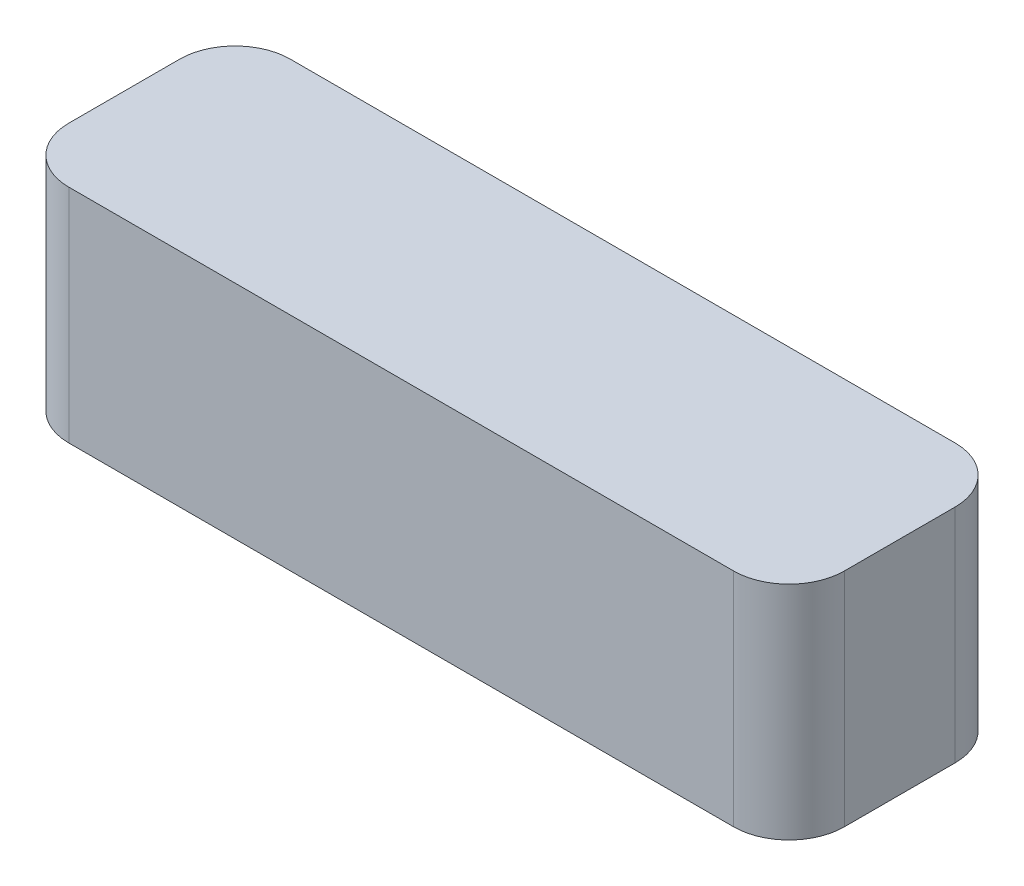
ISO-10303-21;
HEADER;
FILE_DESCRIPTION(('STEP AP214'),'2;1');
FILE_NAME('part.step','',(''),(''),'','','');
FILE_SCHEMA(('AUTOMOTIVE_DESIGN { 1 0 10303 214 1 1 1 1 }'));
ENDSEC;
DATA;
#1=APPLICATION_CONTEXT('core data for automotive mechanical design processes');
#2=APPLICATION_PROTOCOL_DEFINITION('international standard','automotive_design',2000,#1);
#3=PRODUCT_CONTEXT('',#1,'mechanical');
#4=PRODUCT('Part','Part','',(#3));
#5=PRODUCT_RELATED_PRODUCT_CATEGORY('part','',(#4));
#6=PRODUCT_DEFINITION_FORMATION('','',#4);
#7=PRODUCT_DEFINITION_CONTEXT('part definition',#1,'design');
#8=PRODUCT_DEFINITION('design','',#6,#7);
#9=PRODUCT_DEFINITION_SHAPE('','',#8);
#10=(LENGTH_UNIT() NAMED_UNIT(*) SI_UNIT(.MILLI.,.METRE.));
#11=(NAMED_UNIT(*) PLANE_ANGLE_UNIT() SI_UNIT($,.RADIAN.));
#12=(NAMED_UNIT(*) SI_UNIT($,.STERADIAN.) SOLID_ANGLE_UNIT());
#13=UNCERTAINTY_MEASURE_WITH_UNIT(LENGTH_MEASURE(1.E-05),#10,'distance_accuracy_value','');
#14=(GEOMETRIC_REPRESENTATION_CONTEXT(3) GLOBAL_UNCERTAINTY_ASSIGNED_CONTEXT((#13)) GLOBAL_UNIT_ASSIGNED_CONTEXT((#10,
#11,#12)) REPRESENTATION_CONTEXT('',''));
#15=CARTESIAN_POINT('',(0.,0.,0.));
#16=DIRECTION('',(0.,0.,1.));
#17=DIRECTION('',(1.,0.,0.));
#18=AXIS2_PLACEMENT_3D('',#15,#16,#17);
#19=CARTESIAN_POINT('',(6.,4.,-1.));
#20=DIRECTION('',(0.,-1.,0.));
#21=DIRECTION('',(0.,0.,-1.));
#22=AXIS2_PLACEMENT_3D('',#19,#20,#21);
#23=CYLINDRICAL_SURFACE('',#22,1.);
#24=CARTESIAN_POINT('',(6.,0.,-1.));
#25=DIRECTION('',(0.,1.,0.));
#26=DIRECTION('',(0.,0.,-1.));
#27=AXIS2_PLACEMENT_3D('',#24,#25,#26);
#28=CIRCLE('',#27,1.);
#29=CARTESIAN_POINT('',(7.,0.,-0.999999999999994));
#30=VERTEX_POINT('',#29);
#31=CARTESIAN_POINT('',(5.99999999999999,0.,-2.));
#32=VERTEX_POINT('',#31);
#33=EDGE_CURVE('E131',#30,#32,#28,.T.);
#34=ORIENTED_EDGE('',*,*,#33,.T.);
#35=DIRECTION('',(0.,-1.,0.));
#36=VECTOR('',#35,1.);
#37=CARTESIAN_POINT('',(5.99999999999999,4.,-2.));
#38=LINE('',#37,#36);
#39=CARTESIAN_POINT('',(5.99999999999999,4.,-2.));
#40=VERTEX_POINT('',#39);
#41=EDGE_CURVE('E11',#40,#32,#38,.T.);
#42=ORIENTED_EDGE('',*,*,#41,.F.);
#43=CARTESIAN_POINT('',(6.,4.,-1.));
#44=DIRECTION('',(0.,1.,0.));
#45=DIRECTION('',(0.,0.,-1.));
#46=AXIS2_PLACEMENT_3D('',#43,#44,#45);
#47=CIRCLE('',#46,1.);
#48=CARTESIAN_POINT('',(7.,4.,-0.999999999999994));
#49=VERTEX_POINT('',#48);
#50=EDGE_CURVE('E145',#49,#40,#47,.T.);
#51=ORIENTED_EDGE('',*,*,#50,.F.);
#52=DIRECTION('',(0.,-1.,0.));
#53=VECTOR('',#52,1.);
#54=CARTESIAN_POINT('',(7.,4.,-0.999999999999994));
#55=LINE('',#54,#53);
#56=EDGE_CURVE('E127',#49,#30,#55,.T.);
#57=ORIENTED_EDGE('',*,*,#56,.T.);
#58=EDGE_LOOP('',(#34,#42,#51,#57));
#59=FACE_BOUND('',#58,.T.);
#60=ADVANCED_FACE('F35',(#59),#23,.T.);
#61=CARTESIAN_POINT('',(-5.99999999999999,4.,-2.));
#62=DIRECTION('',(0.,0.,1.));
#63=DIRECTION('',(1.,0.,0.));
#64=AXIS2_PLACEMENT_3D('',#61,#62,#63);
#65=PLANE('',#64);
#66=DIRECTION('',(-1.,0.,0.));
#67=VECTOR('',#66,1.);
#68=CARTESIAN_POINT('',(-5.99999999999999,0.,-2.));
#69=LINE('',#68,#67);
#70=CARTESIAN_POINT('',(-5.99999999999999,0.,-2.));
#71=VERTEX_POINT('',#70);
#72=EDGE_CURVE('E134',#32,#71,#69,.T.);
#73=ORIENTED_EDGE('',*,*,#72,.T.);
#74=DIRECTION('',(0.,-1.,0.));
#75=VECTOR('',#74,1.);
#76=CARTESIAN_POINT('',(-5.99999999999999,4.,-2.));
#77=LINE('',#76,#75);
#78=CARTESIAN_POINT('',(-5.99999999999999,4.,-2.));
#79=VERTEX_POINT('',#78);
#80=EDGE_CURVE('E43',#79,#71,#77,.T.);
#81=ORIENTED_EDGE('',*,*,#80,.F.);
#82=DIRECTION('',(-1.,0.,0.));
#83=VECTOR('',#82,1.);
#84=CARTESIAN_POINT('',(-5.99999999999999,4.,-2.));
#85=LINE('',#84,#83);
#86=EDGE_CURVE('E94',#40,#79,#85,.T.);
#87=ORIENTED_EDGE('',*,*,#86,.F.);
#88=ORIENTED_EDGE('',*,*,#41,.T.);
#89=EDGE_LOOP('',(#73,#81,#87,#88));
#90=FACE_BOUND('',#89,.T.);
#91=ADVANCED_FACE('F180',(#90),#65,.F.);
#92=CARTESIAN_POINT('',(-6.,4.,-1.));
#93=DIRECTION('',(0.,-1.,0.));
#94=DIRECTION('',(0.,0.,-1.));
#95=AXIS2_PLACEMENT_3D('',#92,#93,#94);
#96=CYLINDRICAL_SURFACE('',#95,1.);
#97=CARTESIAN_POINT('',(-6.,0.,-1.));
#98=DIRECTION('',(0.,1.,0.));
#99=DIRECTION('',(0.,0.,1.));
#100=AXIS2_PLACEMENT_3D('',#97,#98,#99);
#101=CIRCLE('',#100,1.);
#102=CARTESIAN_POINT('',(-7.,0.,-0.999999999999994));
#103=VERTEX_POINT('',#102);
#104=EDGE_CURVE('E136',#71,#103,#101,.T.);
#105=ORIENTED_EDGE('',*,*,#104,.T.);
#106=DIRECTION('',(0.,-1.,0.));
#107=VECTOR('',#106,1.);
#108=CARTESIAN_POINT('',(-7.,4.,-0.999999999999994));
#109=LINE('',#108,#107);
#110=CARTESIAN_POINT('',(-7.,4.,-0.999999999999994));
#111=VERTEX_POINT('',#110);
#112=EDGE_CURVE('E152',#111,#103,#109,.T.);
#113=ORIENTED_EDGE('',*,*,#112,.F.);
#114=CARTESIAN_POINT('',(-6.,4.,-1.));
#115=DIRECTION('',(0.,1.,0.));
#116=DIRECTION('',(0.,0.,1.));
#117=AXIS2_PLACEMENT_3D('',#114,#115,#116);
#118=CIRCLE('',#117,1.);
#119=EDGE_CURVE('E160',#79,#111,#118,.T.);
#120=ORIENTED_EDGE('',*,*,#119,.F.);
#121=ORIENTED_EDGE('',*,*,#80,.T.);
#122=EDGE_LOOP('',(#105,#113,#120,#121));
#123=FACE_BOUND('',#122,.T.);
#124=ADVANCED_FACE('F158',(#123),#96,.T.);
#125=CARTESIAN_POINT('',(-7.,4.,-0.999999999999993));
#126=DIRECTION('',(1.,0.,0.));
#127=DIRECTION('',(0.,0.,-1.));
#128=AXIS2_PLACEMENT_3D('',#125,#126,#127);
#129=PLANE('',#128);
#130=DIRECTION('',(0.,0.,1.));
#131=VECTOR('',#130,1.);
#132=CARTESIAN_POINT('',(-7.,0.,-0.999999999999993));
#133=LINE('',#132,#131);
#134=CARTESIAN_POINT('',(-7.,0.,0.999999999999992));
#135=VERTEX_POINT('',#134);
#136=EDGE_CURVE('E138',#103,#135,#133,.T.);
#137=ORIENTED_EDGE('',*,*,#136,.T.);
#138=DIRECTION('',(0.,-1.,0.));
#139=VECTOR('',#138,1.);
#140=CARTESIAN_POINT('',(-7.,4.,0.999999999999992));
#141=LINE('',#140,#139);
#142=CARTESIAN_POINT('',(-7.,4.,0.999999999999992));
#143=VERTEX_POINT('',#142);
#144=EDGE_CURVE('E149',#143,#135,#141,.T.);
#145=ORIENTED_EDGE('',*,*,#144,.F.);
#146=DIRECTION('',(0.,0.,1.));
#147=VECTOR('',#146,1.);
#148=CARTESIAN_POINT('',(-7.,4.,-0.999999999999993));
#149=LINE('',#148,#147);
#150=EDGE_CURVE('E172',#111,#143,#149,.T.);
#151=ORIENTED_EDGE('',*,*,#150,.F.);
#152=ORIENTED_EDGE('',*,*,#112,.T.);
#153=EDGE_LOOP('',(#137,#145,#151,#152));
#154=FACE_BOUND('',#153,.T.);
#155=ADVANCED_FACE('F168',(#154),#129,.F.);
#156=CARTESIAN_POINT('',(-6.,4.,1.));
#157=DIRECTION('',(0.,-1.,0.));
#158=DIRECTION('',(0.,0.,-1.));
#159=AXIS2_PLACEMENT_3D('',#156,#157,#158);
#160=CYLINDRICAL_SURFACE('',#159,1.);
#161=CARTESIAN_POINT('',(-6.,0.,1.));
#162=DIRECTION('',(0.,1.,0.));
#163=DIRECTION('',(0.,0.,1.));
#164=AXIS2_PLACEMENT_3D('',#161,#162,#163);
#165=CIRCLE('',#164,1.);
#166=CARTESIAN_POINT('',(-6.,0.,2.));
#167=VERTEX_POINT('',#166);
#168=EDGE_CURVE('E140',#135,#167,#165,.T.);
#169=ORIENTED_EDGE('',*,*,#168,.T.);
#170=DIRECTION('',(0.,-1.,0.));
#171=VECTOR('',#170,1.);
#172=CARTESIAN_POINT('',(-6.,4.,2.));
#173=LINE('',#172,#171);
#174=CARTESIAN_POINT('',(-6.,4.,2.));
#175=VERTEX_POINT('',#174);
#176=EDGE_CURVE('E122',#175,#167,#173,.T.);
#177=ORIENTED_EDGE('',*,*,#176,.F.);
#178=CARTESIAN_POINT('',(-6.,4.,1.));
#179=DIRECTION('',(0.,1.,0.));
#180=DIRECTION('',(0.,0.,1.));
#181=AXIS2_PLACEMENT_3D('',#178,#179,#180);
#182=CIRCLE('',#181,1.);
#183=EDGE_CURVE('E113',#143,#175,#182,.T.);
#184=ORIENTED_EDGE('',*,*,#183,.F.);
#185=ORIENTED_EDGE('',*,*,#144,.T.);
#186=EDGE_LOOP('',(#169,#177,#184,#185));
#187=FACE_BOUND('',#186,.T.);
#188=ADVANCED_FACE('F171',(#187),#160,.T.);
#189=CARTESIAN_POINT('',(-5.99999999999999,4.,2.));
#190=DIRECTION('',(0.,0.,-1.));
#191=DIRECTION('',(-1.,0.,0.));
#192=AXIS2_PLACEMENT_3D('',#189,#190,#191);
#193=PLANE('',#192);
#194=DIRECTION('',(1.,0.,0.));
#195=VECTOR('',#194,1.);
#196=CARTESIAN_POINT('',(-5.99999999999999,0.,2.));
#197=LINE('',#196,#195);
#198=CARTESIAN_POINT('',(5.99999999999999,0.,2.));
#199=VERTEX_POINT('',#198);
#200=EDGE_CURVE('E121',#167,#199,#197,.T.);
#201=ORIENTED_EDGE('',*,*,#200,.T.);
#202=DIRECTION('',(0.,-1.,0.));
#203=VECTOR('',#202,1.);
#204=CARTESIAN_POINT('',(5.99999999999999,4.,2.));
#205=LINE('',#204,#203);
#206=CARTESIAN_POINT('',(5.99999999999999,4.,2.));
#207=VERTEX_POINT('',#206);
#208=EDGE_CURVE('E118',#207,#199,#205,.T.);
#209=ORIENTED_EDGE('',*,*,#208,.F.);
#210=DIRECTION('',(1.,0.,0.));
#211=VECTOR('',#210,1.);
#212=CARTESIAN_POINT('',(-5.99999999999999,4.,2.));
#213=LINE('',#212,#211);
#214=EDGE_CURVE('E107',#175,#207,#213,.T.);
#215=ORIENTED_EDGE('',*,*,#214,.F.);
#216=ORIENTED_EDGE('',*,*,#176,.T.);
#217=EDGE_LOOP('',(#201,#209,#215,#216));
#218=FACE_BOUND('',#217,.T.);
#219=ADVANCED_FACE('F119',(#218),#193,.F.);
#220=CARTESIAN_POINT('',(6.,4.,1.));
#221=DIRECTION('',(0.,-1.,0.));
#222=DIRECTION('',(0.,0.,-1.));
#223=AXIS2_PLACEMENT_3D('',#220,#221,#222);
#224=CYLINDRICAL_SURFACE('',#223,1.);
#225=CARTESIAN_POINT('',(6.,0.,1.));
#226=DIRECTION('',(0.,1.,0.));
#227=DIRECTION('',(0.,0.,1.));
#228=AXIS2_PLACEMENT_3D('',#225,#226,#227);
#229=CIRCLE('',#228,1.);
#230=CARTESIAN_POINT('',(7.,0.,0.999999999999993));
#231=VERTEX_POINT('',#230);
#232=EDGE_CURVE('E80',#199,#231,#229,.T.);
#233=ORIENTED_EDGE('',*,*,#232,.T.);
#234=DIRECTION('',(0.,-1.,0.));
#235=VECTOR('',#234,1.);
#236=CARTESIAN_POINT('',(7.,4.,0.999999999999993));
#237=LINE('',#236,#235);
#238=CARTESIAN_POINT('',(7.,4.,0.999999999999993));
#239=VERTEX_POINT('',#238);
#240=EDGE_CURVE('E123',#239,#231,#237,.T.);
#241=ORIENTED_EDGE('',*,*,#240,.F.);
#242=CARTESIAN_POINT('',(6.,4.,1.));
#243=DIRECTION('',(0.,1.,0.));
#244=DIRECTION('',(0.,0.,1.));
#245=AXIS2_PLACEMENT_3D('',#242,#243,#244);
#246=CIRCLE('',#245,1.);
#247=EDGE_CURVE('E111',#207,#239,#246,.T.);
#248=ORIENTED_EDGE('',*,*,#247,.F.);
#249=ORIENTED_EDGE('',*,*,#208,.T.);
#250=EDGE_LOOP('',(#233,#241,#248,#249));
#251=FACE_BOUND('',#250,.T.);
#252=ADVANCED_FACE('F125',(#251),#224,.T.);
#253=CARTESIAN_POINT('',(7.,4.,-0.999999999999994));
#254=DIRECTION('',(-1.,0.,0.));
#255=DIRECTION('',(0.,0.,1.));
#256=AXIS2_PLACEMENT_3D('',#253,#254,#255);
#257=PLANE('',#256);
#258=DIRECTION('',(0.,0.,-1.));
#259=VECTOR('',#258,1.);
#260=CARTESIAN_POINT('',(7.,0.,-0.999999999999994));
#261=LINE('',#260,#259);
#262=EDGE_CURVE('E86',#231,#30,#261,.T.);
#263=ORIENTED_EDGE('',*,*,#262,.T.);
#264=ORIENTED_EDGE('',*,*,#56,.F.);
#265=DIRECTION('',(0.,0.,-1.));
#266=VECTOR('',#265,1.);
#267=CARTESIAN_POINT('',(7.,4.,-0.999999999999994));
#268=LINE('',#267,#266);
#269=EDGE_CURVE('E51',#239,#49,#268,.T.);
#270=ORIENTED_EDGE('',*,*,#269,.F.);
#271=ORIENTED_EDGE('',*,*,#240,.T.);
#272=EDGE_LOOP('',(#263,#264,#270,#271));
#273=FACE_BOUND('',#272,.T.);
#274=ADVANCED_FACE('F196',(#273),#257,.F.);
#275=CARTESIAN_POINT('',(6.,4.,-1.));
#276=DIRECTION('',(0.,-1.,0.));
#277=DIRECTION('',(0.,0.,-1.));
#278=AXIS2_PLACEMENT_3D('',#275,#276,#277);
#279=PLANE('',#278);
#280=ORIENTED_EDGE('',*,*,#50,.T.);
#281=ORIENTED_EDGE('',*,*,#86,.T.);
#282=ORIENTED_EDGE('',*,*,#119,.T.);
#283=ORIENTED_EDGE('',*,*,#150,.T.);
#284=ORIENTED_EDGE('',*,*,#183,.T.);
#285=ORIENTED_EDGE('',*,*,#214,.T.);
#286=ORIENTED_EDGE('',*,*,#247,.T.);
#287=ORIENTED_EDGE('',*,*,#269,.T.);
#288=EDGE_LOOP('',(#280,#281,#282,#283,#284,#285,#286,#287));
#289=FACE_BOUND('',#288,.T.);
#290=ADVANCED_FACE('F109',(#289),#279,.F.);
#291=CARTESIAN_POINT('',(6.,0.,-1.));
#292=DIRECTION('',(0.,-1.,0.));
#293=DIRECTION('',(0.,0.,-1.));
#294=AXIS2_PLACEMENT_3D('',#291,#292,#293);
#295=PLANE('',#294);
#296=ORIENTED_EDGE('',*,*,#33,.F.);
#297=ORIENTED_EDGE('',*,*,#262,.F.);
#298=ORIENTED_EDGE('',*,*,#232,.F.);
#299=ORIENTED_EDGE('',*,*,#200,.F.);
#300=ORIENTED_EDGE('',*,*,#168,.F.);
#301=ORIENTED_EDGE('',*,*,#136,.F.);
#302=ORIENTED_EDGE('',*,*,#104,.F.);
#303=ORIENTED_EDGE('',*,*,#72,.F.);
#304=EDGE_LOOP('',(#296,#297,#298,#299,#300,#301,#302,#303));
#305=FACE_BOUND('',#304,.T.);
#306=ADVANCED_FACE('F164',(#305),#295,.T.);
#307=CLOSED_SHELL('',(#60,#91,#124,#155,#188,#219,#252,#274,#290,#306));
#308=MANIFOLD_SOLID_BREP('B2',#307);
#309=ADVANCED_BREP_SHAPE_REPRESENTATION('',(#18,#308),#14);
#310=SHAPE_DEFINITION_REPRESENTATION(#9,#309);
ENDSEC;
END-ISO-10303-21;
